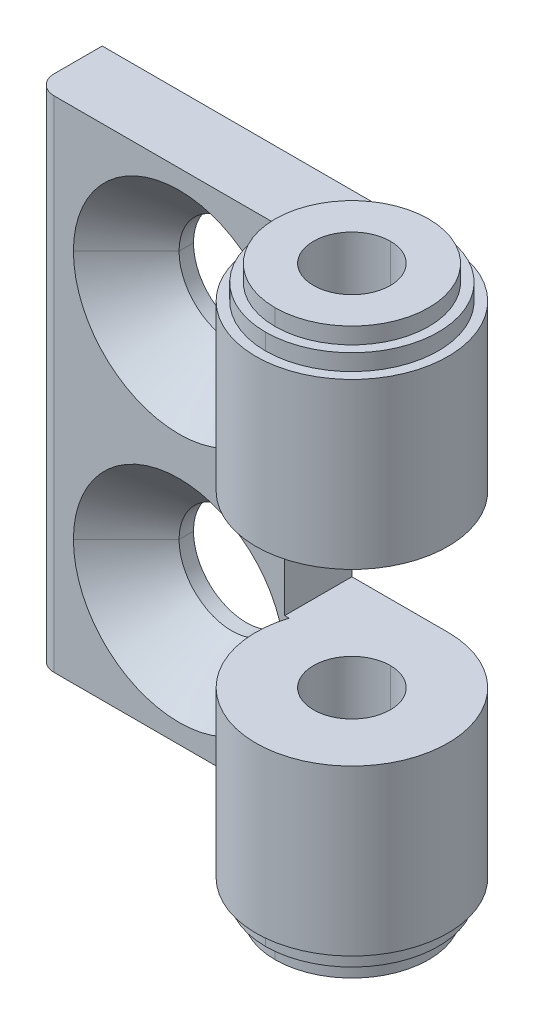
ISO-10303-21;
HEADER;
FILE_DESCRIPTION(('STEP AP214'),'2;1');
FILE_NAME('part.step','',(''),(''),'','','');
FILE_SCHEMA(('AUTOMOTIVE_DESIGN { 1 0 10303 214 1 1 1 1 }'));
ENDSEC;
DATA;
#1=APPLICATION_CONTEXT('core data for automotive mechanical design processes');
#2=APPLICATION_PROTOCOL_DEFINITION('international standard','automotive_design',2000,#1);
#3=PRODUCT_CONTEXT('',#1,'mechanical');
#4=PRODUCT('Part','Part','',(#3));
#5=PRODUCT_RELATED_PRODUCT_CATEGORY('part','',(#4));
#6=PRODUCT_DEFINITION_FORMATION('','',#4);
#7=PRODUCT_DEFINITION_CONTEXT('part definition',#1,'design');
#8=PRODUCT_DEFINITION('design','',#6,#7);
#9=PRODUCT_DEFINITION_SHAPE('','',#8);
#10=(LENGTH_UNIT() NAMED_UNIT(*) SI_UNIT(.MILLI.,.METRE.));
#11=(NAMED_UNIT(*) PLANE_ANGLE_UNIT() SI_UNIT($,.RADIAN.));
#12=(NAMED_UNIT(*) SI_UNIT($,.STERADIAN.) SOLID_ANGLE_UNIT());
#13=UNCERTAINTY_MEASURE_WITH_UNIT(LENGTH_MEASURE(1.E-05),#10,'distance_accuracy_value','');
#14=(GEOMETRIC_REPRESENTATION_CONTEXT(3) GLOBAL_UNCERTAINTY_ASSIGNED_CONTEXT((#13)) GLOBAL_UNIT_ASSIGNED_CONTEXT((#10,
#11,#12)) REPRESENTATION_CONTEXT('',''));
#15=CARTESIAN_POINT('',(0.,0.,0.));
#16=DIRECTION('',(0.,0.,1.));
#17=DIRECTION('',(1.,0.,0.));
#18=AXIS2_PLACEMENT_3D('',#15,#16,#17);
#19=CARTESIAN_POINT('',(0.,13.,0.));
#20=DIRECTION('',(0.,-1.,0.));
#21=DIRECTION('',(0.,0.,-1.));
#22=AXIS2_PLACEMENT_3D('',#19,#20,#21);
#23=PLANE('',#22);
#24=CARTESIAN_POINT('',(0.,13.,0.));
#25=DIRECTION('',(0.,-1.,0.));
#26=DIRECTION('',(0.,0.,-1.));
#27=AXIS2_PLACEMENT_3D('',#24,#25,#26);
#28=CIRCLE('',#27,5.);
#29=CARTESIAN_POINT('',(0.,13.,-5.));
#30=VERTEX_POINT('',#29);
#31=CARTESIAN_POINT('',(-4.76969600708473,13.,-1.5));
#32=VERTEX_POINT('',#31);
#33=EDGE_CURVE('E11',#30,#32,#28,.T.);
#34=ORIENTED_EDGE('',*,*,#33,.F.);
#35=DIRECTION('',(-1.,0.,0.));
#36=VECTOR('',#35,1.);
#37=CARTESIAN_POINT('',(0.,13.,-5.));
#38=LINE('',#37,#36);
#39=CARTESIAN_POINT('',(-18.,13.,-5.));
#40=VERTEX_POINT('',#39);
#41=EDGE_CURVE('E25',#30,#40,#38,.T.);
#42=ORIENTED_EDGE('',*,*,#41,.T.);
#43=DIRECTION('',(0.,0.,-1.));
#44=VECTOR('',#43,1.);
#45=CARTESIAN_POINT('',(-18.,13.,-1.5));
#46=LINE('',#45,#44);
#47=CARTESIAN_POINT('',(-18.,13.,-2.5));
#48=VERTEX_POINT('',#47);
#49=EDGE_CURVE('E571',#48,#40,#46,.T.);
#50=ORIENTED_EDGE('',*,*,#49,.F.);
#51=CARTESIAN_POINT('',(-17.0000000000007,13.,-2.49999999999931));
#52=DIRECTION('',(0.,1.,0.));
#53=DIRECTION('',(1.,0.,0.));
#54=AXIS2_PLACEMENT_3D('',#51,#52,#53);
#55=CIRCLE('',#54,0.999999999999312);
#56=CARTESIAN_POINT('',(-17.,13.,-1.5));
#57=VERTEX_POINT('',#56);
#58=EDGE_CURVE('E567',#48,#57,#55,.T.);
#59=ORIENTED_EDGE('',*,*,#58,.T.);
#60=DIRECTION('',(-1.,0.,0.));
#61=VECTOR('',#60,1.);
#62=CARTESIAN_POINT('',(0.,13.,-1.5));
#63=LINE('',#62,#61);
#64=EDGE_CURVE('E562',#32,#57,#63,.T.);
#65=ORIENTED_EDGE('',*,*,#64,.F.);
#66=EDGE_LOOP('',(#34,#42,#50,#59,#65));
#67=FACE_BOUND('',#66,.T.);
#68=CARTESIAN_POINT('',(0.,13.,0.));
#69=DIRECTION('',(0.,-1.,0.));
#70=DIRECTION('',(0.,0.,-1.));
#71=AXIS2_PLACEMENT_3D('',#68,#69,#70);
#72=CIRCLE('',#71,4.5);
#73=CARTESIAN_POINT('',(0.,13.,-4.5));
#74=VERTEX_POINT('',#73);
#75=CARTESIAN_POINT('',(0.,13.,4.5));
#76=VERTEX_POINT('',#75);
#77=EDGE_CURVE('E558',#74,#76,#72,.T.);
#78=ORIENTED_EDGE('',*,*,#77,.T.);
#79=CARTESIAN_POINT('',(0.,13.,0.));
#80=DIRECTION('',(0.,-1.,0.));
#81=DIRECTION('',(0.,0.,-1.));
#82=AXIS2_PLACEMENT_3D('',#79,#80,#81);
#83=CIRCLE('',#82,4.5);
#84=EDGE_CURVE('E554',#76,#74,#83,.T.);
#85=ORIENTED_EDGE('',*,*,#84,.T.);
#86=EDGE_LOOP('',(#78,#85));
#87=FACE_BOUND('',#86,.T.);
#88=ADVANCED_FACE('F17',(#67,#87),#23,.F.);
#89=CARTESIAN_POINT('',(0.,13.,0.));
#90=DIRECTION('',(0.,-1.,0.));
#91=DIRECTION('',(1.,0.,0.));
#92=AXIS2_PLACEMENT_3D('',#89,#90,#91);
#93=CYLINDRICAL_SURFACE('',#92,4.5);
#94=DIRECTION('',(0.,-1.,0.));
#95=VECTOR('',#94,1.);
#96=CARTESIAN_POINT('',(0.,13.85,4.5));
#97=LINE('',#96,#95);
#98=CARTESIAN_POINT('',(0.,13.85,4.5));
#99=VERTEX_POINT('',#98);
#100=EDGE_CURVE('E549',#99,#76,#97,.T.);
#101=ORIENTED_EDGE('',*,*,#100,.F.);
#102=CARTESIAN_POINT('',(0.,13.85,0.));
#103=DIRECTION('',(0.,-1.,0.));
#104=DIRECTION('',(0.,0.,-1.));
#105=AXIS2_PLACEMENT_3D('',#102,#103,#104);
#106=CIRCLE('',#105,4.5);
#107=CARTESIAN_POINT('',(0.,13.85,-4.5));
#108=VERTEX_POINT('',#107);
#109=EDGE_CURVE('E545',#99,#108,#106,.T.);
#110=ORIENTED_EDGE('',*,*,#109,.T.);
#111=DIRECTION('',(0.,-1.,0.));
#112=VECTOR('',#111,1.);
#113=CARTESIAN_POINT('',(0.,13.85,-4.5));
#114=LINE('',#113,#112);
#115=EDGE_CURVE('E540',#108,#74,#114,.T.);
#116=ORIENTED_EDGE('',*,*,#115,.T.);
#117=ORIENTED_EDGE('',*,*,#84,.F.);
#118=EDGE_LOOP('',(#101,#110,#116,#117));
#119=FACE_BOUND('',#118,.T.);
#120=ADVANCED_FACE('F632',(#119),#93,.T.);
#121=CARTESIAN_POINT('',(0.,13.,0.));
#122=DIRECTION('',(0.,-1.,0.));
#123=DIRECTION('',(-1.,0.,0.));
#124=AXIS2_PLACEMENT_3D('',#121,#122,#123);
#125=CYLINDRICAL_SURFACE('',#124,4.5);
#126=ORIENTED_EDGE('',*,*,#100,.T.);
#127=ORIENTED_EDGE('',*,*,#77,.F.);
#128=ORIENTED_EDGE('',*,*,#115,.F.);
#129=CARTESIAN_POINT('',(0.,13.85,0.));
#130=DIRECTION('',(0.,-1.,0.));
#131=DIRECTION('',(0.,0.,-1.));
#132=AXIS2_PLACEMENT_3D('',#129,#130,#131);
#133=CIRCLE('',#132,4.5);
#134=EDGE_CURVE('E535',#108,#99,#133,.T.);
#135=ORIENTED_EDGE('',*,*,#134,.T.);
#136=EDGE_LOOP('',(#126,#127,#128,#135));
#137=FACE_BOUND('',#136,.T.);
#138=ADVANCED_FACE('F636',(#137),#125,.T.);
#139=CARTESIAN_POINT('',(4.,13.85,0.));
#140=DIRECTION('',(0.,-1.,0.));
#141=DIRECTION('',(0.,0.,-1.));
#142=AXIS2_PLACEMENT_3D('',#139,#140,#141);
#143=PLANE('',#142);
#144=ORIENTED_EDGE('',*,*,#109,.F.);
#145=ORIENTED_EDGE('',*,*,#134,.F.);
#146=EDGE_LOOP('',(#144,#145));
#147=FACE_BOUND('',#146,.T.);
#148=CARTESIAN_POINT('',(0.,13.85,0.));
#149=DIRECTION('',(0.,-1.,0.));
#150=DIRECTION('',(0.,0.,-1.));
#151=AXIS2_PLACEMENT_3D('',#148,#149,#150);
#152=CIRCLE('',#151,4.);
#153=CARTESIAN_POINT('',(0.,13.85,-4.));
#154=VERTEX_POINT('',#153);
#155=CARTESIAN_POINT('',(0.,13.85,4.));
#156=VERTEX_POINT('',#155);
#157=EDGE_CURVE('E531',#154,#156,#152,.T.);
#158=ORIENTED_EDGE('',*,*,#157,.T.);
#159=CARTESIAN_POINT('',(0.,13.85,0.));
#160=DIRECTION('',(0.,-1.,0.));
#161=DIRECTION('',(0.,0.,-1.));
#162=AXIS2_PLACEMENT_3D('',#159,#160,#161);
#163=CIRCLE('',#162,4.);
#164=EDGE_CURVE('E527',#156,#154,#163,.T.);
#165=ORIENTED_EDGE('',*,*,#164,.T.);
#166=EDGE_LOOP('',(#158,#165));
#167=FACE_BOUND('',#166,.T.);
#168=ADVANCED_FACE('F641',(#147,#167),#143,.F.);
#169=CARTESIAN_POINT('',(0.,13.,0.));
#170=DIRECTION('',(0.,-1.,0.));
#171=DIRECTION('',(1.,0.,0.));
#172=AXIS2_PLACEMENT_3D('',#169,#170,#171);
#173=CYLINDRICAL_SURFACE('',#172,4.);
#174=DIRECTION('',(0.,-1.,0.));
#175=VECTOR('',#174,1.);
#176=CARTESIAN_POINT('',(0.,14.7,4.));
#177=LINE('',#176,#175);
#178=CARTESIAN_POINT('',(0.,14.7,4.));
#179=VERTEX_POINT('',#178);
#180=EDGE_CURVE('E522',#179,#156,#177,.T.);
#181=ORIENTED_EDGE('',*,*,#180,.F.);
#182=CARTESIAN_POINT('',(0.,14.7,0.));
#183=DIRECTION('',(0.,-1.,0.));
#184=DIRECTION('',(0.,0.,-1.));
#185=AXIS2_PLACEMENT_3D('',#182,#183,#184);
#186=CIRCLE('',#185,4.);
#187=CARTESIAN_POINT('',(0.,14.7,-4.));
#188=VERTEX_POINT('',#187);
#189=EDGE_CURVE('E518',#179,#188,#186,.T.);
#190=ORIENTED_EDGE('',*,*,#189,.T.);
#191=DIRECTION('',(0.,-1.,0.));
#192=VECTOR('',#191,1.);
#193=CARTESIAN_POINT('',(0.,14.7,-4.));
#194=LINE('',#193,#192);
#195=EDGE_CURVE('E513',#188,#154,#194,.T.);
#196=ORIENTED_EDGE('',*,*,#195,.T.);
#197=ORIENTED_EDGE('',*,*,#164,.F.);
#198=EDGE_LOOP('',(#181,#190,#196,#197));
#199=FACE_BOUND('',#198,.T.);
#200=ADVANCED_FACE('F647',(#199),#173,.T.);
#201=CARTESIAN_POINT('',(0.,13.,0.));
#202=DIRECTION('',(0.,-1.,0.));
#203=DIRECTION('',(-1.,0.,0.));
#204=AXIS2_PLACEMENT_3D('',#201,#202,#203);
#205=CYLINDRICAL_SURFACE('',#204,4.);
#206=ORIENTED_EDGE('',*,*,#180,.T.);
#207=ORIENTED_EDGE('',*,*,#157,.F.);
#208=ORIENTED_EDGE('',*,*,#195,.F.);
#209=CARTESIAN_POINT('',(0.,14.7,0.));
#210=DIRECTION('',(0.,-1.,0.));
#211=DIRECTION('',(0.,0.,-1.));
#212=AXIS2_PLACEMENT_3D('',#209,#210,#211);
#213=CIRCLE('',#212,4.);
#214=EDGE_CURVE('E508',#188,#179,#213,.T.);
#215=ORIENTED_EDGE('',*,*,#214,.T.);
#216=EDGE_LOOP('',(#206,#207,#208,#215));
#217=FACE_BOUND('',#216,.T.);
#218=ADVANCED_FACE('F651',(#217),#205,.T.);
#219=CARTESIAN_POINT('',(0.,14.7,0.));
#220=DIRECTION('',(0.,-1.,0.));
#221=DIRECTION('',(0.,0.,-1.));
#222=AXIS2_PLACEMENT_3D('',#219,#220,#221);
#223=PLANE('',#222);
#224=ORIENTED_EDGE('',*,*,#189,.F.);
#225=ORIENTED_EDGE('',*,*,#214,.F.);
#226=EDGE_LOOP('',(#224,#225));
#227=FACE_BOUND('',#226,.T.);
#228=CARTESIAN_POINT('',(0.,14.7,0.));
#229=DIRECTION('',(0.,1.,0.));
#230=DIRECTION('',(0.,0.,-1.));
#231=AXIS2_PLACEMENT_3D('',#228,#229,#230);
#232=CIRCLE('',#231,2.);
#233=CARTESIAN_POINT('',(0.,14.7,2.));
#234=VERTEX_POINT('',#233);
#235=CARTESIAN_POINT('',(0.,14.7,-2.));
#236=VERTEX_POINT('',#235);
#237=EDGE_CURVE('E503',#234,#236,#232,.T.);
#238=ORIENTED_EDGE('',*,*,#237,.F.);
#239=CARTESIAN_POINT('',(0.,14.7,0.));
#240=DIRECTION('',(0.,1.,0.));
#241=DIRECTION('',(0.,0.,-1.));
#242=AXIS2_PLACEMENT_3D('',#239,#240,#241);
#243=CIRCLE('',#242,2.);
#244=EDGE_CURVE('E498',#236,#234,#243,.T.);
#245=ORIENTED_EDGE('',*,*,#244,.F.);
#246=EDGE_LOOP('',(#238,#245));
#247=FACE_BOUND('',#246,.T.);
#248=ADVANCED_FACE('F655',(#227,#247),#223,.F.);
#249=CARTESIAN_POINT('',(0.,-16.2,0.));
#250=DIRECTION('',(0.,-1.,0.));
#251=DIRECTION('',(1.,0.,0.));
#252=AXIS2_PLACEMENT_3D('',#249,#250,#251);
#253=CYLINDRICAL_SURFACE('',#252,2.);
#254=DIRECTION('',(0.,-1.,0.));
#255=VECTOR('',#254,1.);
#256=CARTESIAN_POINT('',(0.,14.7,2.));
#257=LINE('',#256,#255);
#258=CARTESIAN_POINT('',(0.,4.4333333333333,2.));
#259=VERTEX_POINT('',#258);
#260=EDGE_CURVE('E494',#234,#259,#257,.T.);
#261=ORIENTED_EDGE('',*,*,#260,.T.);
#262=CARTESIAN_POINT('',(0.,4.4333333333333,0.));
#263=DIRECTION('',(0.,-1.,0.));
#264=DIRECTION('',(0.,0.,1.));
#265=AXIS2_PLACEMENT_3D('',#262,#263,#264);
#266=CIRCLE('',#265,2.);
#267=CARTESIAN_POINT('',(0.,4.4333333333333,-2.));
#268=VERTEX_POINT('',#267);
#269=EDGE_CURVE('E490',#259,#268,#266,.T.);
#270=ORIENTED_EDGE('',*,*,#269,.T.);
#271=DIRECTION('',(0.,-1.,0.));
#272=VECTOR('',#271,1.);
#273=CARTESIAN_POINT('',(0.,14.7,-2.));
#274=LINE('',#273,#272);
#275=EDGE_CURVE('E485',#236,#268,#274,.T.);
#276=ORIENTED_EDGE('',*,*,#275,.F.);
#277=ORIENTED_EDGE('',*,*,#244,.T.);
#278=EDGE_LOOP('',(#261,#270,#276,#277));
#279=FACE_BOUND('',#278,.T.);
#280=ADVANCED_FACE('F627',(#279),#253,.F.);
#281=CARTESIAN_POINT('',(0.,-16.2,0.));
#282=DIRECTION('',(0.,-1.,0.));
#283=DIRECTION('',(-1.,0.,0.));
#284=AXIS2_PLACEMENT_3D('',#281,#282,#283);
#285=CYLINDRICAL_SURFACE('',#284,2.);
#286=ORIENTED_EDGE('',*,*,#260,.F.);
#287=ORIENTED_EDGE('',*,*,#237,.T.);
#288=ORIENTED_EDGE('',*,*,#275,.T.);
#289=CARTESIAN_POINT('',(0.,4.4333333333333,0.));
#290=DIRECTION('',(0.,-1.,0.));
#291=DIRECTION('',(0.,0.,1.));
#292=AXIS2_PLACEMENT_3D('',#289,#290,#291);
#293=CIRCLE('',#292,2.);
#294=EDGE_CURVE('E480',#268,#259,#293,.T.);
#295=ORIENTED_EDGE('',*,*,#294,.T.);
#296=EDGE_LOOP('',(#286,#287,#288,#295));
#297=FACE_BOUND('',#296,.T.);
#298=ADVANCED_FACE('F617',(#297),#285,.F.);
#299=CARTESIAN_POINT('',(-5.,4.4333333333333,21.));
#300=DIRECTION('',(0.,1.,0.));
#301=DIRECTION('',(0.,0.,1.));
#302=AXIS2_PLACEMENT_3D('',#299,#300,#301);
#303=PLANE('',#302);
#304=ORIENTED_EDGE('',*,*,#294,.F.);
#305=ORIENTED_EDGE('',*,*,#269,.F.);
#306=EDGE_LOOP('',(#304,#305));
#307=FACE_BOUND('',#306,.T.);
#308=CARTESIAN_POINT('',(0.,4.4333333333333,0.));
#309=DIRECTION('',(0.,1.,0.));
#310=DIRECTION('',(0.,0.,1.));
#311=AXIS2_PLACEMENT_3D('',#308,#309,#310);
#312=CIRCLE('',#311,5.);
#313=CARTESIAN_POINT('',(-4.76969600708473,4.4333333333333,-1.5));
#314=VERTEX_POINT('',#313);
#315=CARTESIAN_POINT('',(0.,4.4333333333333,-5.));
#316=VERTEX_POINT('',#315);
#317=EDGE_CURVE('E475',#314,#316,#312,.T.);
#318=ORIENTED_EDGE('',*,*,#317,.F.);
#319=DIRECTION('',(-1.,0.,0.));
#320=VECTOR('',#319,1.);
#321=CARTESIAN_POINT('',(0.,4.4333333333333,-1.5));
#322=LINE('',#321,#320);
#323=CARTESIAN_POINT('',(-5.,4.4333333333333,-1.5));
#324=VERTEX_POINT('',#323);
#325=EDGE_CURVE('E471',#314,#324,#322,.T.);
#326=ORIENTED_EDGE('',*,*,#325,.T.);
#327=DIRECTION('',(0.,0.,-1.));
#328=VECTOR('',#327,1.);
#329=CARTESIAN_POINT('',(-5.,4.4333333333333,21.));
#330=LINE('',#329,#328);
#331=CARTESIAN_POINT('',(-5.,4.4333333333333,-5.));
#332=VERTEX_POINT('',#331);
#333=EDGE_CURVE('E467',#324,#332,#330,.T.);
#334=ORIENTED_EDGE('',*,*,#333,.T.);
#335=DIRECTION('',(1.,0.,0.));
#336=VECTOR('',#335,1.);
#337=CARTESIAN_POINT('',(-5.,4.4333333333333,-5.));
#338=LINE('',#337,#336);
#339=EDGE_CURVE('E463',#332,#316,#338,.T.);
#340=ORIENTED_EDGE('',*,*,#339,.T.);
#341=EDGE_LOOP('',(#318,#326,#334,#340));
#342=FACE_BOUND('',#341,.T.);
#343=ADVANCED_FACE('F615',(#307,#342),#303,.F.);
#344=CARTESIAN_POINT('',(0.,0.,-5.));
#345=DIRECTION('',(0.,0.,1.));
#346=DIRECTION('',(1.,0.,0.));
#347=AXIS2_PLACEMENT_3D('',#344,#345,#346);
#348=PLANE('',#347);
#349=CARTESIAN_POINT('',(-10.5,-6.5,-5.));
#350=DIRECTION('',(0.,0.,1.));
#351=DIRECTION('',(1.,0.,0.));
#352=AXIS2_PLACEMENT_3D('',#349,#350,#351);
#353=CIRCLE('',#352,2.75);
#354=CARTESIAN_POINT('',(-7.75,-6.5,-5.));
#355=VERTEX_POINT('',#354);
#356=CARTESIAN_POINT('',(-13.25,-6.5,-5.));
#357=VERTEX_POINT('',#356);
#358=EDGE_CURVE('E459',#355,#357,#353,.T.);
#359=ORIENTED_EDGE('',*,*,#358,.T.);
#360=CARTESIAN_POINT('',(-10.5,-6.5,-5.));
#361=DIRECTION('',(0.,0.,1.));
#362=DIRECTION('',(1.,0.,0.));
#363=AXIS2_PLACEMENT_3D('',#360,#361,#362);
#364=CIRCLE('',#363,2.75);
#365=EDGE_CURVE('E455',#357,#355,#364,.T.);
#366=ORIENTED_EDGE('',*,*,#365,.T.);
#367=EDGE_LOOP('',(#359,#366));
#368=FACE_BOUND('',#367,.T.);
#369=CARTESIAN_POINT('',(-10.5,6.5,-5.));
#370=DIRECTION('',(0.,0.,1.));
#371=DIRECTION('',(1.,0.,0.));
#372=AXIS2_PLACEMENT_3D('',#369,#370,#371);
#373=CIRCLE('',#372,2.75);
#374=CARTESIAN_POINT('',(-7.75,6.5,-5.));
#375=VERTEX_POINT('',#374);
#376=CARTESIAN_POINT('',(-13.25,6.5,-5.));
#377=VERTEX_POINT('',#376);
#378=EDGE_CURVE('E451',#375,#377,#373,.T.);
#379=ORIENTED_EDGE('',*,*,#378,.T.);
#380=CARTESIAN_POINT('',(-10.5,6.5,-5.));
#381=DIRECTION('',(0.,0.,1.));
#382=DIRECTION('',(1.,0.,0.));
#383=AXIS2_PLACEMENT_3D('',#380,#381,#382);
#384=CIRCLE('',#383,2.75);
#385=EDGE_CURVE('E447',#377,#375,#384,.T.);
#386=ORIENTED_EDGE('',*,*,#385,.T.);
#387=EDGE_LOOP('',(#379,#386));
#388=FACE_BOUND('',#387,.T.);
#389=DIRECTION('',(0.,1.,0.));
#390=VECTOR('',#389,1.);
#391=CARTESIAN_POINT('',(0.,-13.,-5.));
#392=LINE('',#391,#390);
#393=EDGE_CURVE('E443',#316,#30,#392,.T.);
#394=ORIENTED_EDGE('',*,*,#393,.F.);
#395=ORIENTED_EDGE('',*,*,#339,.F.);
#396=DIRECTION('',(0.,1.,0.));
#397=VECTOR('',#396,1.);
#398=CARTESIAN_POINT('',(-5.,-4.4333333333333,-5.));
#399=LINE('',#398,#397);
#400=CARTESIAN_POINT('',(-5.,-4.4333333333333,-5.));
#401=VERTEX_POINT('',#400);
#402=EDGE_CURVE('E438',#401,#332,#399,.T.);
#403=ORIENTED_EDGE('',*,*,#402,.F.);
#404=DIRECTION('',(-1.,0.,0.));
#405=VECTOR('',#404,1.);
#406=CARTESIAN_POINT('',(5.,-4.4333333333333,-5.));
#407=LINE('',#406,#405);
#408=CARTESIAN_POINT('',(0.,-4.4333333333333,-5.));
#409=VERTEX_POINT('',#408);
#410=EDGE_CURVE('E433',#409,#401,#407,.T.);
#411=ORIENTED_EDGE('',*,*,#410,.F.);
#412=DIRECTION('',(0.,1.,0.));
#413=VECTOR('',#412,1.);
#414=CARTESIAN_POINT('',(0.,-13.,-5.));
#415=LINE('',#414,#413);
#416=CARTESIAN_POINT('',(0.,-13.,-5.));
#417=VERTEX_POINT('',#416);
#418=EDGE_CURVE('E428',#417,#409,#415,.T.);
#419=ORIENTED_EDGE('',*,*,#418,.F.);
#420=DIRECTION('',(1.,0.,0.));
#421=VECTOR('',#420,1.);
#422=CARTESIAN_POINT('',(-18.,-13.,-5.));
#423=LINE('',#422,#421);
#424=CARTESIAN_POINT('',(-18.,-13.,-5.));
#425=VERTEX_POINT('',#424);
#426=EDGE_CURVE('E423',#425,#417,#423,.T.);
#427=ORIENTED_EDGE('',*,*,#426,.F.);
#428=DIRECTION('',(0.,-1.,0.));
#429=VECTOR('',#428,1.);
#430=CARTESIAN_POINT('',(-18.,13.,-5.));
#431=LINE('',#430,#429);
#432=EDGE_CURVE('E418',#40,#425,#431,.T.);
#433=ORIENTED_EDGE('',*,*,#432,.F.);
#434=ORIENTED_EDGE('',*,*,#41,.F.);
#435=EDGE_LOOP('',(#394,#395,#403,#411,#419,#427,#433,#434));
#436=FACE_BOUND('',#435,.T.);
#437=ADVANCED_FACE('F601',(#368,#388,#436),#348,.F.);
#438=CARTESIAN_POINT('',(-18.,13.,-1.5));
#439=DIRECTION('',(1.,0.,0.));
#440=DIRECTION('',(0.,0.,-1.));
#441=AXIS2_PLACEMENT_3D('',#438,#439,#440);
#442=PLANE('',#441);
#443=DIRECTION('',(0.,0.,-1.));
#444=VECTOR('',#443,1.);
#445=CARTESIAN_POINT('',(-18.,-13.,-1.5));
#446=LINE('',#445,#444);
#447=CARTESIAN_POINT('',(-18.,-13.,-2.5));
#448=VERTEX_POINT('',#447);
#449=EDGE_CURVE('E413',#448,#425,#446,.T.);
#450=ORIENTED_EDGE('',*,*,#449,.F.);
#451=DIRECTION('',(0.,-1.,0.));
#452=VECTOR('',#451,1.);
#453=CARTESIAN_POINT('',(-18.,13.,-2.5));
#454=LINE('',#453,#452);
#455=EDGE_CURVE('E408',#48,#448,#454,.T.);
#456=ORIENTED_EDGE('',*,*,#455,.F.);
#457=ORIENTED_EDGE('',*,*,#49,.T.);
#458=ORIENTED_EDGE('',*,*,#432,.T.);
#459=EDGE_LOOP('',(#450,#456,#457,#458));
#460=FACE_BOUND('',#459,.T.);
#461=ADVANCED_FACE('F582',(#460),#442,.F.);
#462=CARTESIAN_POINT('',(-17.0000000000007,13.,-2.49999999999931));
#463=DIRECTION('',(0.,-1.,0.));
#464=DIRECTION('',(0.707106781185398,0.,-0.707106781187697));
#465=AXIS2_PLACEMENT_3D('',#462,#463,#464);
#466=CYLINDRICAL_SURFACE('',#465,0.999999999999312);
#467=CARTESIAN_POINT('',(-17.0000000000007,-13.,-2.49999999999931));
#468=DIRECTION('',(0.,1.,0.));
#469=DIRECTION('',(1.,0.,0.));
#470=AXIS2_PLACEMENT_3D('',#467,#468,#469);
#471=CIRCLE('',#470,0.999999999999312);
#472=CARTESIAN_POINT('',(-17.,-13.,-1.5));
#473=VERTEX_POINT('',#472);
#474=EDGE_CURVE('E404',#448,#473,#471,.T.);
#475=ORIENTED_EDGE('',*,*,#474,.T.);
#476=DIRECTION('',(0.,-1.,0.));
#477=VECTOR('',#476,1.);
#478=CARTESIAN_POINT('',(-17.,13.,-1.5));
#479=LINE('',#478,#477);
#480=EDGE_CURVE('E399',#57,#473,#479,.T.);
#481=ORIENTED_EDGE('',*,*,#480,.F.);
#482=ORIENTED_EDGE('',*,*,#58,.F.);
#483=ORIENTED_EDGE('',*,*,#455,.T.);
#484=EDGE_LOOP('',(#475,#481,#482,#483));
#485=FACE_BOUND('',#484,.T.);
#486=ADVANCED_FACE('F587',(#485),#466,.T.);
#487=CARTESIAN_POINT('',(0.,0.,-1.5));
#488=DIRECTION('',(0.,0.,1.));
#489=DIRECTION('',(1.,0.,0.));
#490=AXIS2_PLACEMENT_3D('',#487,#488,#489);
#491=PLANE('',#490);
#492=ORIENTED_EDGE('',*,*,#480,.T.);
#493=DIRECTION('',(1.,0.,0.));
#494=VECTOR('',#493,1.);
#495=CARTESIAN_POINT('',(-18.,-13.,-1.5));
#496=LINE('',#495,#494);
#497=CARTESIAN_POINT('',(-4.76969600708473,-13.,-1.5));
#498=VERTEX_POINT('',#497);
#499=EDGE_CURVE('E395',#473,#498,#496,.T.);
#500=ORIENTED_EDGE('',*,*,#499,.T.);
#501=DIRECTION('',(0.,-1.,0.));
#502=VECTOR('',#501,1.);
#503=CARTESIAN_POINT('',(-4.76969600708473,-13.,-1.5));
#504=LINE('',#503,#502);
#505=CARTESIAN_POINT('',(-4.76969600708473,-4.4333333333333,-1.5));
#506=VERTEX_POINT('',#505);
#507=EDGE_CURVE('E390',#506,#498,#504,.T.);
#508=ORIENTED_EDGE('',*,*,#507,.F.);
#509=DIRECTION('',(1.,0.,0.));
#510=VECTOR('',#509,1.);
#511=CARTESIAN_POINT('',(0.,-4.4333333333333,-1.5));
#512=LINE('',#511,#510);
#513=CARTESIAN_POINT('',(-5.,-4.4333333333333,-1.5));
#514=VERTEX_POINT('',#513);
#515=EDGE_CURVE('E385',#514,#506,#512,.T.);
#516=ORIENTED_EDGE('',*,*,#515,.F.);
#517=DIRECTION('',(0.,-1.,0.));
#518=VECTOR('',#517,1.);
#519=CARTESIAN_POINT('',(-5.,0.,-1.5));
#520=LINE('',#519,#518);
#521=EDGE_CURVE('E380',#324,#514,#520,.T.);
#522=ORIENTED_EDGE('',*,*,#521,.F.);
#523=ORIENTED_EDGE('',*,*,#325,.F.);
#524=DIRECTION('',(0.,-1.,0.));
#525=VECTOR('',#524,1.);
#526=CARTESIAN_POINT('',(-4.76969600708473,-13.,-1.5));
#527=LINE('',#526,#525);
#528=EDGE_CURVE('E375',#32,#314,#527,.T.);
#529=ORIENTED_EDGE('',*,*,#528,.F.);
#530=ORIENTED_EDGE('',*,*,#64,.T.);
#531=EDGE_LOOP('',(#492,#500,#508,#516,#522,#523,#529,#530));
#532=FACE_BOUND('',#531,.T.);
#533=CARTESIAN_POINT('',(-10.5,-6.5,-1.5));
#534=DIRECTION('',(0.,0.,1.));
#535=DIRECTION('',(1.,0.,0.));
#536=AXIS2_PLACEMENT_3D('',#533,#534,#535);
#537=CIRCLE('',#536,5.5);
#538=CARTESIAN_POINT('',(-16.,-6.5,-1.5));
#539=VERTEX_POINT('',#538);
#540=CARTESIAN_POINT('',(-5.,-6.5,-1.5));
#541=VERTEX_POINT('',#540);
#542=EDGE_CURVE('E370',#539,#541,#537,.T.);
#543=ORIENTED_EDGE('',*,*,#542,.F.);
#544=CARTESIAN_POINT('',(-10.5,-6.5,-1.5));
#545=DIRECTION('',(0.,0.,1.));
#546=DIRECTION('',(1.,0.,0.));
#547=AXIS2_PLACEMENT_3D('',#544,#545,#546);
#548=CIRCLE('',#547,5.5);
#549=EDGE_CURVE('E365',#541,#539,#548,.T.);
#550=ORIENTED_EDGE('',*,*,#549,.F.);
#551=EDGE_LOOP('',(#543,#550));
#552=FACE_BOUND('',#551,.T.);
#553=CARTESIAN_POINT('',(-10.5,6.5,-1.5));
#554=DIRECTION('',(0.,0.,1.));
#555=DIRECTION('',(1.,0.,0.));
#556=AXIS2_PLACEMENT_3D('',#553,#554,#555);
#557=CIRCLE('',#556,5.5);
#558=CARTESIAN_POINT('',(-16.,6.5,-1.5));
#559=VERTEX_POINT('',#558);
#560=CARTESIAN_POINT('',(-5.,6.5,-1.5));
#561=VERTEX_POINT('',#560);
#562=EDGE_CURVE('E360',#559,#561,#557,.T.);
#563=ORIENTED_EDGE('',*,*,#562,.F.);
#564=CARTESIAN_POINT('',(-10.5,6.5,-1.5));
#565=DIRECTION('',(0.,0.,1.));
#566=DIRECTION('',(1.,0.,0.));
#567=AXIS2_PLACEMENT_3D('',#564,#565,#566);
#568=CIRCLE('',#567,5.5);
#569=EDGE_CURVE('E355',#561,#559,#568,.T.);
#570=ORIENTED_EDGE('',*,*,#569,.F.);
#571=EDGE_LOOP('',(#563,#570));
#572=FACE_BOUND('',#571,.T.);
#573=ADVANCED_FACE('F592',(#532,#552,#572),#491,.T.);
#574=CARTESIAN_POINT('',(-10.5,6.5,-4.25));
#575=DIRECTION('',(0.,0.,1.));
#576=DIRECTION('',(0.,-1.,0.));
#577=AXIS2_PLACEMENT_3D('',#574,#575,#576);
#578=CONICAL_SURFACE('',#577,2.75,0.785398163397448);
#579=DIRECTION('',(-0.707106781186548,0.,0.707106781186547));
#580=VECTOR('',#579,1.);
#581=CARTESIAN_POINT('',(-13.25,6.5,-4.25));
#582=LINE('',#581,#580);
#583=CARTESIAN_POINT('',(-13.25,6.5,-4.25));
#584=VERTEX_POINT('',#583);
#585=EDGE_CURVE('E350',#584,#559,#582,.T.);
#586=ORIENTED_EDGE('',*,*,#585,.F.);
#587=CARTESIAN_POINT('',(-10.5,6.5,-4.25));
#588=DIRECTION('',(0.,0.,1.));
#589=DIRECTION('',(1.,0.,0.));
#590=AXIS2_PLACEMENT_3D('',#587,#588,#589);
#591=CIRCLE('',#590,2.75);
#592=CARTESIAN_POINT('',(-7.75,6.5,-4.25));
#593=VERTEX_POINT('',#592);
#594=EDGE_CURVE('E345',#593,#584,#591,.T.);
#595=ORIENTED_EDGE('',*,*,#594,.F.);
#596=DIRECTION('',(0.707106781186548,0.,0.707106781186548));
#597=VECTOR('',#596,1.);
#598=CARTESIAN_POINT('',(-7.75,6.5,-4.25));
#599=LINE('',#598,#597);
#600=EDGE_CURVE('E340',#593,#561,#599,.T.);
#601=ORIENTED_EDGE('',*,*,#600,.T.);
#602=ORIENTED_EDGE('',*,*,#569,.T.);
#603=EDGE_LOOP('',(#586,#595,#601,#602));
#604=FACE_BOUND('',#603,.T.);
#605=ADVANCED_FACE('F719',(#604),#578,.F.);
#606=CARTESIAN_POINT('',(-10.5,6.5,-4.25));
#607=DIRECTION('',(0.,0.,1.));
#608=DIRECTION('',(0.,1.,0.));
#609=AXIS2_PLACEMENT_3D('',#606,#607,#608);
#610=CONICAL_SURFACE('',#609,2.75,0.785398163397448);
#611=ORIENTED_EDGE('',*,*,#585,.T.);
#612=ORIENTED_EDGE('',*,*,#562,.T.);
#613=ORIENTED_EDGE('',*,*,#600,.F.);
#614=CARTESIAN_POINT('',(-10.5,6.5,-4.25));
#615=DIRECTION('',(0.,0.,1.));
#616=DIRECTION('',(1.,0.,0.));
#617=AXIS2_PLACEMENT_3D('',#614,#615,#616);
#618=CIRCLE('',#617,2.75);
#619=EDGE_CURVE('E335',#584,#593,#618,.T.);
#620=ORIENTED_EDGE('',*,*,#619,.F.);
#621=EDGE_LOOP('',(#611,#612,#613,#620));
#622=FACE_BOUND('',#621,.T.);
#623=ADVANCED_FACE('F729',(#622),#610,.F.);
#624=CARTESIAN_POINT('',(-10.5,6.5,-1.5));
#625=DIRECTION('',(0.,0.,1.));
#626=DIRECTION('',(0.,1.,0.));
#627=AXIS2_PLACEMENT_3D('',#624,#625,#626);
#628=CYLINDRICAL_SURFACE('',#627,2.75);
#629=DIRECTION('',(0.,0.,1.));
#630=VECTOR('',#629,1.);
#631=CARTESIAN_POINT('',(-13.25,6.5,-5.));
#632=LINE('',#631,#630);
#633=EDGE_CURVE('E330',#377,#584,#632,.T.);
#634=ORIENTED_EDGE('',*,*,#633,.T.);
#635=ORIENTED_EDGE('',*,*,#619,.T.);
#636=DIRECTION('',(0.,0.,1.));
#637=VECTOR('',#636,1.);
#638=CARTESIAN_POINT('',(-7.75,6.5,-5.));
#639=LINE('',#638,#637);
#640=EDGE_CURVE('E325',#375,#593,#639,.T.);
#641=ORIENTED_EDGE('',*,*,#640,.F.);
#642=ORIENTED_EDGE('',*,*,#385,.F.);
#643=EDGE_LOOP('',(#634,#635,#641,#642));
#644=FACE_BOUND('',#643,.T.);
#645=ADVANCED_FACE('F740',(#644),#628,.F.);
#646=CARTESIAN_POINT('',(-10.5,6.5,-1.5));
#647=DIRECTION('',(0.,0.,1.));
#648=DIRECTION('',(0.,-1.,0.));
#649=AXIS2_PLACEMENT_3D('',#646,#647,#648);
#650=CYLINDRICAL_SURFACE('',#649,2.75);
#651=ORIENTED_EDGE('',*,*,#633,.F.);
#652=ORIENTED_EDGE('',*,*,#378,.F.);
#653=ORIENTED_EDGE('',*,*,#640,.T.);
#654=ORIENTED_EDGE('',*,*,#594,.T.);
#655=EDGE_LOOP('',(#651,#652,#653,#654));
#656=FACE_BOUND('',#655,.T.);
#657=ADVANCED_FACE('F751',(#656),#650,.F.);
#658=CARTESIAN_POINT('',(-10.5,-6.5,-4.25));
#659=DIRECTION('',(0.,0.,1.));
#660=DIRECTION('',(0.,-1.,0.));
#661=AXIS2_PLACEMENT_3D('',#658,#659,#660);
#662=CONICAL_SURFACE('',#661,2.75,0.785398163397448);
#663=DIRECTION('',(-0.707106781186548,0.,0.707106781186547));
#664=VECTOR('',#663,1.);
#665=CARTESIAN_POINT('',(-13.25,-6.5,-4.25));
#666=LINE('',#665,#664);
#667=CARTESIAN_POINT('',(-13.25,-6.5,-4.25));
#668=VERTEX_POINT('',#667);
#669=EDGE_CURVE('E320',#668,#539,#666,.T.);
#670=ORIENTED_EDGE('',*,*,#669,.F.);
#671=CARTESIAN_POINT('',(-10.5,-6.5,-4.25));
#672=DIRECTION('',(0.,0.,1.));
#673=DIRECTION('',(1.,0.,0.));
#674=AXIS2_PLACEMENT_3D('',#671,#672,#673);
#675=CIRCLE('',#674,2.75);
#676=CARTESIAN_POINT('',(-7.75,-6.5,-4.25));
#677=VERTEX_POINT('',#676);
#678=EDGE_CURVE('E315',#677,#668,#675,.T.);
#679=ORIENTED_EDGE('',*,*,#678,.F.);
#680=DIRECTION('',(0.707106781186548,0.,0.707106781186548));
#681=VECTOR('',#680,1.);
#682=CARTESIAN_POINT('',(-7.75,-6.5,-4.25));
#683=LINE('',#682,#681);
#684=EDGE_CURVE('E310',#677,#541,#683,.T.);
#685=ORIENTED_EDGE('',*,*,#684,.T.);
#686=ORIENTED_EDGE('',*,*,#549,.T.);
#687=EDGE_LOOP('',(#670,#679,#685,#686));
#688=FACE_BOUND('',#687,.T.);
#689=ADVANCED_FACE('F762',(#688),#662,.F.);
#690=CARTESIAN_POINT('',(-10.5,-6.5,-4.25));
#691=DIRECTION('',(0.,0.,1.));
#692=DIRECTION('',(0.,1.,0.));
#693=AXIS2_PLACEMENT_3D('',#690,#691,#692);
#694=CONICAL_SURFACE('',#693,2.75,0.785398163397448);
#695=ORIENTED_EDGE('',*,*,#669,.T.);
#696=ORIENTED_EDGE('',*,*,#542,.T.);
#697=ORIENTED_EDGE('',*,*,#684,.F.);
#698=CARTESIAN_POINT('',(-10.5,-6.5,-4.25));
#699=DIRECTION('',(0.,0.,1.));
#700=DIRECTION('',(1.,0.,0.));
#701=AXIS2_PLACEMENT_3D('',#698,#699,#700);
#702=CIRCLE('',#701,2.75);
#703=EDGE_CURVE('E305',#668,#677,#702,.T.);
#704=ORIENTED_EDGE('',*,*,#703,.F.);
#705=EDGE_LOOP('',(#695,#696,#697,#704));
#706=FACE_BOUND('',#705,.T.);
#707=ADVANCED_FACE('F773',(#706),#694,.F.);
#708=CARTESIAN_POINT('',(-10.5,-6.5,-1.5));
#709=DIRECTION('',(0.,0.,1.));
#710=DIRECTION('',(0.,1.,0.));
#711=AXIS2_PLACEMENT_3D('',#708,#709,#710);
#712=CYLINDRICAL_SURFACE('',#711,2.75);
#713=DIRECTION('',(0.,0.,1.));
#714=VECTOR('',#713,1.);
#715=CARTESIAN_POINT('',(-13.25,-6.5,-5.));
#716=LINE('',#715,#714);
#717=EDGE_CURVE('E300',#357,#668,#716,.T.);
#718=ORIENTED_EDGE('',*,*,#717,.T.);
#719=ORIENTED_EDGE('',*,*,#703,.T.);
#720=DIRECTION('',(0.,0.,1.));
#721=VECTOR('',#720,1.);
#722=CARTESIAN_POINT('',(-7.75,-6.5,-5.));
#723=LINE('',#722,#721);
#724=EDGE_CURVE('E295',#355,#677,#723,.T.);
#725=ORIENTED_EDGE('',*,*,#724,.F.);
#726=ORIENTED_EDGE('',*,*,#365,.F.);
#727=EDGE_LOOP('',(#718,#719,#725,#726));
#728=FACE_BOUND('',#727,.T.);
#729=ADVANCED_FACE('F784',(#728),#712,.F.);
#730=CARTESIAN_POINT('',(-10.5,-6.5,-1.5));
#731=DIRECTION('',(0.,0.,1.));
#732=DIRECTION('',(0.,-1.,0.));
#733=AXIS2_PLACEMENT_3D('',#730,#731,#732);
#734=CYLINDRICAL_SURFACE('',#733,2.75);
#735=ORIENTED_EDGE('',*,*,#717,.F.);
#736=ORIENTED_EDGE('',*,*,#358,.F.);
#737=ORIENTED_EDGE('',*,*,#724,.T.);
#738=ORIENTED_EDGE('',*,*,#678,.T.);
#739=EDGE_LOOP('',(#735,#736,#737,#738));
#740=FACE_BOUND('',#739,.T.);
#741=ADVANCED_FACE('F795',(#740),#734,.F.);
#742=CARTESIAN_POINT('',(0.,-13.,0.));
#743=DIRECTION('',(0.,-1.,0.));
#744=DIRECTION('',(-0.591607972515193,0.,-0.806225779082053));
#745=AXIS2_PLACEMENT_3D('',#742,#743,#744);
#746=CYLINDRICAL_SURFACE('',#745,5.);
#747=ORIENTED_EDGE('',*,*,#393,.T.);
#748=ORIENTED_EDGE('',*,*,#33,.T.);
#749=ORIENTED_EDGE('',*,*,#528,.T.);
#750=ORIENTED_EDGE('',*,*,#317,.T.);
#751=EDGE_LOOP('',(#747,#748,#749,#750));
#752=FACE_BOUND('',#751,.T.);
#753=ADVANCED_FACE('F597',(#752),#746,.T.);
#754=CARTESIAN_POINT('',(-5.,-4.4333333333333,21.));
#755=DIRECTION('',(-1.,0.,0.));
#756=DIRECTION('',(0.,0.,1.));
#757=AXIS2_PLACEMENT_3D('',#754,#755,#756);
#758=PLANE('',#757);
#759=ORIENTED_EDGE('',*,*,#521,.T.);
#760=DIRECTION('',(0.,0.,-1.));
#761=VECTOR('',#760,1.);
#762=CARTESIAN_POINT('',(-5.,-4.4333333333333,21.));
#763=LINE('',#762,#761);
#764=EDGE_CURVE('E290',#514,#401,#763,.T.);
#765=ORIENTED_EDGE('',*,*,#764,.T.);
#766=ORIENTED_EDGE('',*,*,#402,.T.);
#767=ORIENTED_EDGE('',*,*,#333,.F.);
#768=EDGE_LOOP('',(#759,#765,#766,#767));
#769=FACE_BOUND('',#768,.T.);
#770=ADVANCED_FACE('F613',(#769),#758,.F.);
#771=CARTESIAN_POINT('',(5.,-4.4333333333333,21.));
#772=DIRECTION('',(0.,-1.,0.));
#773=DIRECTION('',(0.,0.,-1.));
#774=AXIS2_PLACEMENT_3D('',#771,#772,#773);
#775=PLANE('',#774);
#776=CARTESIAN_POINT('',(0.,-4.4333333333333,0.));
#777=DIRECTION('',(0.,1.,0.));
#778=DIRECTION('',(0.,0.,-1.));
#779=AXIS2_PLACEMENT_3D('',#776,#777,#778);
#780=CIRCLE('',#779,2.);
#781=CARTESIAN_POINT('',(0.,-4.4333333333333,2.));
#782=VERTEX_POINT('',#781);
#783=CARTESIAN_POINT('',(0.,-4.4333333333333,-2.));
#784=VERTEX_POINT('',#783);
#785=EDGE_CURVE('E286',#782,#784,#780,.T.);
#786=ORIENTED_EDGE('',*,*,#785,.F.);
#787=CARTESIAN_POINT('',(0.,-4.4333333333333,0.));
#788=DIRECTION('',(0.,1.,0.));
#789=DIRECTION('',(0.,0.,-1.));
#790=AXIS2_PLACEMENT_3D('',#787,#788,#789);
#791=CIRCLE('',#790,2.);
#792=EDGE_CURVE('E205',#784,#782,#791,.T.);
#793=ORIENTED_EDGE('',*,*,#792,.F.);
#794=EDGE_LOOP('',(#786,#793));
#795=FACE_BOUND('',#794,.T.);
#796=ORIENTED_EDGE('',*,*,#410,.T.);
#797=ORIENTED_EDGE('',*,*,#764,.F.);
#798=ORIENTED_EDGE('',*,*,#515,.T.);
#799=CARTESIAN_POINT('',(0.,-4.4333333333333,0.));
#800=DIRECTION('',(0.,-1.,0.));
#801=DIRECTION('',(0.,0.,-1.));
#802=AXIS2_PLACEMENT_3D('',#799,#800,#801);
#803=CIRCLE('',#802,5.);
#804=EDGE_CURVE('E278',#409,#506,#803,.T.);
#805=ORIENTED_EDGE('',*,*,#804,.F.);
#806=EDGE_LOOP('',(#796,#797,#798,#805));
#807=FACE_BOUND('',#806,.T.);
#808=ADVANCED_FACE('F609',(#795,#807),#775,.F.);
#809=CARTESIAN_POINT('',(0.,-13.,0.));
#810=DIRECTION('',(0.,-1.,0.));
#811=DIRECTION('',(-0.591607972515193,0.,-0.806225779082053));
#812=AXIS2_PLACEMENT_3D('',#809,#810,#811);
#813=CYLINDRICAL_SURFACE('',#812,5.);
#814=CARTESIAN_POINT('',(0.,-13.,0.));
#815=DIRECTION('',(0.,-1.,0.));
#816=DIRECTION('',(0.,0.,-1.));
#817=AXIS2_PLACEMENT_3D('',#814,#815,#816);
#818=CIRCLE('',#817,5.);
#819=EDGE_CURVE('E273',#417,#498,#818,.T.);
#820=ORIENTED_EDGE('',*,*,#819,.F.);
#821=ORIENTED_EDGE('',*,*,#418,.T.);
#822=ORIENTED_EDGE('',*,*,#804,.T.);
#823=ORIENTED_EDGE('',*,*,#507,.T.);
#824=EDGE_LOOP('',(#820,#821,#822,#823));
#825=FACE_BOUND('',#824,.T.);
#826=ADVANCED_FACE('F606',(#825),#813,.T.);
#827=CARTESIAN_POINT('',(5.,-13.,0.));
#828=DIRECTION('',(0.,1.,0.));
#829=DIRECTION('',(0.,0.,1.));
#830=AXIS2_PLACEMENT_3D('',#827,#828,#829);
#831=PLANE('',#830);
#832=CARTESIAN_POINT('',(0.,-13.,0.));
#833=DIRECTION('',(0.,-1.,0.));
#834=DIRECTION('',(0.,0.,-1.));
#835=AXIS2_PLACEMENT_3D('',#832,#833,#834);
#836=CIRCLE('',#835,4.5);
#837=CARTESIAN_POINT('',(0.,-13.,4.5));
#838=VERTEX_POINT('',#837);
#839=CARTESIAN_POINT('',(0.,-13.,-4.5));
#840=VERTEX_POINT('',#839);
#841=EDGE_CURVE('E268',#838,#840,#836,.T.);
#842=ORIENTED_EDGE('',*,*,#841,.F.);
#843=CARTESIAN_POINT('',(0.,-13.,0.));
#844=DIRECTION('',(0.,-1.,0.));
#845=DIRECTION('',(0.,0.,-1.));
#846=AXIS2_PLACEMENT_3D('',#843,#844,#845);
#847=CIRCLE('',#846,4.5);
#848=EDGE_CURVE('E263',#840,#838,#847,.T.);
#849=ORIENTED_EDGE('',*,*,#848,.F.);
#850=EDGE_LOOP('',(#842,#849));
#851=FACE_BOUND('',#850,.T.);
#852=ORIENTED_EDGE('',*,*,#499,.F.);
#853=ORIENTED_EDGE('',*,*,#474,.F.);
#854=ORIENTED_EDGE('',*,*,#449,.T.);
#855=ORIENTED_EDGE('',*,*,#426,.T.);
#856=ORIENTED_EDGE('',*,*,#819,.T.);
#857=EDGE_LOOP('',(#852,#853,#854,#855,#856));
#858=FACE_BOUND('',#857,.T.);
#859=ADVANCED_FACE('F604',(#851,#858),#831,.F.);
#860=CARTESIAN_POINT('',(0.,-14.7,0.));
#861=DIRECTION('',(0.,-1.,0.));
#862=DIRECTION('',(-1.,0.,0.));
#863=AXIS2_PLACEMENT_3D('',#860,#861,#862);
#864=CYLINDRICAL_SURFACE('',#863,4.5);
#865=DIRECTION('',(0.,-1.,0.));
#866=VECTOR('',#865,1.);
#867=CARTESIAN_POINT('',(0.,-13.,4.5));
#868=LINE('',#867,#866);
#869=CARTESIAN_POINT('',(0.,-13.85,4.5));
#870=VERTEX_POINT('',#869);
#871=EDGE_CURVE('E259',#838,#870,#868,.T.);
#872=ORIENTED_EDGE('',*,*,#871,.T.);
#873=CARTESIAN_POINT('',(0.,-13.85,0.));
#874=DIRECTION('',(0.,-1.,0.));
#875=DIRECTION('',(0.,0.,-1.));
#876=AXIS2_PLACEMENT_3D('',#873,#874,#875);
#877=CIRCLE('',#876,4.5);
#878=CARTESIAN_POINT('',(0.,-13.85,-4.5));
#879=VERTEX_POINT('',#878);
#880=EDGE_CURVE('E254',#879,#870,#877,.T.);
#881=ORIENTED_EDGE('',*,*,#880,.F.);
#882=DIRECTION('',(0.,-1.,0.));
#883=VECTOR('',#882,1.);
#884=CARTESIAN_POINT('',(0.,-13.,-4.5));
#885=LINE('',#884,#883);
#886=EDGE_CURVE('E249',#840,#879,#885,.T.);
#887=ORIENTED_EDGE('',*,*,#886,.F.);
#888=ORIENTED_EDGE('',*,*,#848,.T.);
#889=EDGE_LOOP('',(#872,#881,#887,#888));
#890=FACE_BOUND('',#889,.T.);
#891=ADVANCED_FACE('F853',(#890),#864,.T.);
#892=CARTESIAN_POINT('',(0.,-14.7,0.));
#893=DIRECTION('',(0.,-1.,0.));
#894=DIRECTION('',(1.,0.,0.));
#895=AXIS2_PLACEMENT_3D('',#892,#893,#894);
#896=CYLINDRICAL_SURFACE('',#895,4.5);
#897=ORIENTED_EDGE('',*,*,#871,.F.);
#898=ORIENTED_EDGE('',*,*,#841,.T.);
#899=ORIENTED_EDGE('',*,*,#886,.T.);
#900=CARTESIAN_POINT('',(0.,-13.85,0.));
#901=DIRECTION('',(0.,-1.,0.));
#902=DIRECTION('',(0.,0.,-1.));
#903=AXIS2_PLACEMENT_3D('',#900,#901,#902);
#904=CIRCLE('',#903,4.5);
#905=EDGE_CURVE('E244',#870,#879,#904,.T.);
#906=ORIENTED_EDGE('',*,*,#905,.F.);
#907=EDGE_LOOP('',(#897,#898,#899,#906));
#908=FACE_BOUND('',#907,.T.);
#909=ADVANCED_FACE('F864',(#908),#896,.T.);
#910=CARTESIAN_POINT('',(4.5,-13.85,0.));
#911=DIRECTION('',(0.,1.,0.));
#912=DIRECTION('',(0.,0.,1.));
#913=AXIS2_PLACEMENT_3D('',#910,#911,#912);
#914=PLANE('',#913);
#915=CARTESIAN_POINT('',(0.,-13.85,0.));
#916=DIRECTION('',(0.,-1.,0.));
#917=DIRECTION('',(0.,0.,-1.));
#918=AXIS2_PLACEMENT_3D('',#915,#916,#917);
#919=CIRCLE('',#918,4.);
#920=CARTESIAN_POINT('',(0.,-13.85,4.));
#921=VERTEX_POINT('',#920);
#922=CARTESIAN_POINT('',(0.,-13.85,-4.));
#923=VERTEX_POINT('',#922);
#924=EDGE_CURVE('E239',#921,#923,#919,.T.);
#925=ORIENTED_EDGE('',*,*,#924,.F.);
#926=CARTESIAN_POINT('',(0.,-13.85,0.));
#927=DIRECTION('',(0.,-1.,0.));
#928=DIRECTION('',(0.,0.,-1.));
#929=AXIS2_PLACEMENT_3D('',#926,#927,#928);
#930=CIRCLE('',#929,4.);
#931=EDGE_CURVE('E234',#923,#921,#930,.T.);
#932=ORIENTED_EDGE('',*,*,#931,.F.);
#933=EDGE_LOOP('',(#925,#932));
#934=FACE_BOUND('',#933,.T.);
#935=ORIENTED_EDGE('',*,*,#880,.T.);
#936=ORIENTED_EDGE('',*,*,#905,.T.);
#937=EDGE_LOOP('',(#935,#936));
#938=FACE_BOUND('',#937,.T.);
#939=ADVANCED_FACE('F875',(#934,#938),#914,.F.);
#940=CARTESIAN_POINT('',(0.,-14.7,0.));
#941=DIRECTION('',(0.,-1.,0.));
#942=DIRECTION('',(-1.,0.,0.));
#943=AXIS2_PLACEMENT_3D('',#940,#941,#942);
#944=CYLINDRICAL_SURFACE('',#943,4.);
#945=DIRECTION('',(0.,-1.,0.));
#946=VECTOR('',#945,1.);
#947=CARTESIAN_POINT('',(0.,-13.85,4.));
#948=LINE('',#947,#946);
#949=CARTESIAN_POINT('',(0.,-14.7,4.));
#950=VERTEX_POINT('',#949);
#951=EDGE_CURVE('E230',#921,#950,#948,.T.);
#952=ORIENTED_EDGE('',*,*,#951,.T.);
#953=CARTESIAN_POINT('',(0.,-14.7,0.));
#954=DIRECTION('',(0.,-1.,0.));
#955=DIRECTION('',(0.,0.,-1.));
#956=AXIS2_PLACEMENT_3D('',#953,#954,#955);
#957=CIRCLE('',#956,4.);
#958=CARTESIAN_POINT('',(0.,-14.7,-4.));
#959=VERTEX_POINT('',#958);
#960=EDGE_CURVE('E225',#959,#950,#957,.T.);
#961=ORIENTED_EDGE('',*,*,#960,.F.);
#962=DIRECTION('',(0.,-1.,0.));
#963=VECTOR('',#962,1.);
#964=CARTESIAN_POINT('',(0.,-13.85,-4.));
#965=LINE('',#964,#963);
#966=EDGE_CURVE('E214',#923,#959,#965,.T.);
#967=ORIENTED_EDGE('',*,*,#966,.F.);
#968=ORIENTED_EDGE('',*,*,#931,.T.);
#969=EDGE_LOOP('',(#952,#961,#967,#968));
#970=FACE_BOUND('',#969,.T.);
#971=ADVANCED_FACE('F886',(#970),#944,.T.);
#972=CARTESIAN_POINT('',(0.,-14.7,0.));
#973=DIRECTION('',(0.,-1.,0.));
#974=DIRECTION('',(1.,0.,0.));
#975=AXIS2_PLACEMENT_3D('',#972,#973,#974);
#976=CYLINDRICAL_SURFACE('',#975,4.);
#977=ORIENTED_EDGE('',*,*,#951,.F.);
#978=ORIENTED_EDGE('',*,*,#924,.T.);
#979=ORIENTED_EDGE('',*,*,#966,.T.);
#980=CARTESIAN_POINT('',(0.,-14.7,0.));
#981=DIRECTION('',(0.,-1.,0.));
#982=DIRECTION('',(0.,0.,-1.));
#983=AXIS2_PLACEMENT_3D('',#980,#981,#982);
#984=CIRCLE('',#983,4.);
#985=EDGE_CURVE('E211',#950,#959,#984,.T.);
#986=ORIENTED_EDGE('',*,*,#985,.F.);
#987=EDGE_LOOP('',(#977,#978,#979,#986));
#988=FACE_BOUND('',#987,.T.);
#989=ADVANCED_FACE('F897',(#988),#976,.T.);
#990=CARTESIAN_POINT('',(4.,-14.7,0.));
#991=DIRECTION('',(0.,1.,0.));
#992=DIRECTION('',(0.,0.,1.));
#993=AXIS2_PLACEMENT_3D('',#990,#991,#992);
#994=PLANE('',#993);
#995=CARTESIAN_POINT('',(0.,-14.7,0.));
#996=DIRECTION('',(0.,-1.,0.));
#997=DIRECTION('',(0.,0.,1.));
#998=AXIS2_PLACEMENT_3D('',#995,#996,#997);
#999=CIRCLE('',#998,2.);
#1000=CARTESIAN_POINT('',(0.,-14.7,-2.));
#1001=VERTEX_POINT('',#1000);
#1002=CARTESIAN_POINT('',(0.,-14.7,2.));
#1003=VERTEX_POINT('',#1002);
#1004=EDGE_CURVE('E196',#1001,#1003,#999,.T.);
#1005=ORIENTED_EDGE('',*,*,#1004,.F.);
#1006=CARTESIAN_POINT('',(0.,-14.7,0.));
#1007=DIRECTION('',(0.,-1.,0.));
#1008=DIRECTION('',(0.,0.,1.));
#1009=AXIS2_PLACEMENT_3D('',#1006,#1007,#1008);
#1010=CIRCLE('',#1009,2.);
#1011=EDGE_CURVE('E191',#1003,#1001,#1010,.T.);
#1012=ORIENTED_EDGE('',*,*,#1011,.F.);
#1013=EDGE_LOOP('',(#1005,#1012));
#1014=FACE_BOUND('',#1013,.T.);
#1015=ORIENTED_EDGE('',*,*,#960,.T.);
#1016=ORIENTED_EDGE('',*,*,#985,.T.);
#1017=EDGE_LOOP('',(#1015,#1016));
#1018=FACE_BOUND('',#1017,.T.);
#1019=ADVANCED_FACE('F193',(#1014,#1018),#994,.F.);
#1020=CARTESIAN_POINT('',(0.,-16.2,0.));
#1021=DIRECTION('',(0.,-1.,0.));
#1022=DIRECTION('',(1.,0.,0.));
#1023=AXIS2_PLACEMENT_3D('',#1020,#1021,#1022);
#1024=CYLINDRICAL_SURFACE('',#1023,2.);
#1025=DIRECTION('',(0.,-1.,0.));
#1026=VECTOR('',#1025,1.);
#1027=CARTESIAN_POINT('',(0.,-4.4333333333333,2.));
#1028=LINE('',#1027,#1026);
#1029=EDGE_CURVE('E200',#782,#1003,#1028,.T.);
#1030=ORIENTED_EDGE('',*,*,#1029,.T.);
#1031=ORIENTED_EDGE('',*,*,#1011,.T.);
#1032=DIRECTION('',(0.,-1.,0.));
#1033=VECTOR('',#1032,1.);
#1034=CARTESIAN_POINT('',(0.,-4.4333333333333,-2.));
#1035=LINE('',#1034,#1033);
#1036=EDGE_CURVE('E208',#784,#1001,#1035,.T.);
#1037=ORIENTED_EDGE('',*,*,#1036,.F.);
#1038=ORIENTED_EDGE('',*,*,#792,.T.);
#1039=EDGE_LOOP('',(#1030,#1031,#1037,#1038));
#1040=FACE_BOUND('',#1039,.T.);
#1041=ADVANCED_FACE('F204',(#1040),#1024,.F.);
#1042=CARTESIAN_POINT('',(0.,-16.2,0.));
#1043=DIRECTION('',(0.,-1.,0.));
#1044=DIRECTION('',(-1.,0.,0.));
#1045=AXIS2_PLACEMENT_3D('',#1042,#1043,#1044);
#1046=CYLINDRICAL_SURFACE('',#1045,2.);
#1047=ORIENTED_EDGE('',*,*,#1029,.F.);
#1048=ORIENTED_EDGE('',*,*,#785,.T.);
#1049=ORIENTED_EDGE('',*,*,#1036,.T.);
#1050=ORIENTED_EDGE('',*,*,#1004,.T.);
#1051=EDGE_LOOP('',(#1047,#1048,#1049,#1050));
#1052=FACE_BOUND('',#1051,.T.);
#1053=ADVANCED_FACE('F210',(#1052),#1046,.F.);
#1054=CLOSED_SHELL('',(#88,#120,#138,#168,#200,#218,#248,#280,#298,#343,#437,#461,#486,#573,
#605,#623,#645,#657,#689,#707,#729,#741,#753,#770,#808,#826,#859,#891,#909,#939,#971,#989,#1019,
#1041,#1053));
#1055=MANIFOLD_SOLID_BREP('B1',#1054);
#1056=ADVANCED_BREP_SHAPE_REPRESENTATION('',(#18,#1055),#14);
#1057=SHAPE_DEFINITION_REPRESENTATION(#9,#1056);
ENDSEC;
END-ISO-10303-21;
